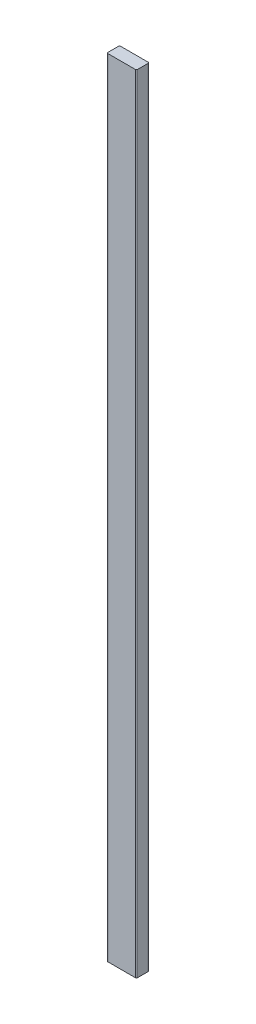
ISO-10303-21;
HEADER;
FILE_DESCRIPTION(('STEP AP214'),'2;1');
FILE_NAME('part.step','',(''),(''),'','','');
FILE_SCHEMA(('AUTOMOTIVE_DESIGN { 1 0 10303 214 1 1 1 1 }'));
ENDSEC;
DATA;
#1=APPLICATION_CONTEXT('core data for automotive mechanical design processes');
#2=APPLICATION_PROTOCOL_DEFINITION('international standard','automotive_design',2000,#1);
#3=PRODUCT_CONTEXT('',#1,'mechanical');
#4=PRODUCT('Part','Part','',(#3));
#5=PRODUCT_RELATED_PRODUCT_CATEGORY('part','',(#4));
#6=PRODUCT_DEFINITION_FORMATION('','',#4);
#7=PRODUCT_DEFINITION_CONTEXT('part definition',#1,'design');
#8=PRODUCT_DEFINITION('design','',#6,#7);
#9=PRODUCT_DEFINITION_SHAPE('','',#8);
#10=(LENGTH_UNIT() NAMED_UNIT(*) SI_UNIT(.MILLI.,.METRE.));
#11=(NAMED_UNIT(*) PLANE_ANGLE_UNIT() SI_UNIT($,.RADIAN.));
#12=(NAMED_UNIT(*) SI_UNIT($,.STERADIAN.) SOLID_ANGLE_UNIT());
#13=UNCERTAINTY_MEASURE_WITH_UNIT(LENGTH_MEASURE(1.E-05),#10,'distance_accuracy_value','');
#14=(GEOMETRIC_REPRESENTATION_CONTEXT(3) GLOBAL_UNCERTAINTY_ASSIGNED_CONTEXT((#13)) GLOBAL_UNIT_ASSIGNED_CONTEXT((#10,
#11,#12)) REPRESENTATION_CONTEXT('',''));
#15=CARTESIAN_POINT('',(0.,0.,0.));
#16=DIRECTION('',(0.,0.,1.));
#17=DIRECTION('',(1.,0.,0.));
#18=AXIS2_PLACEMENT_3D('',#15,#16,#17);
#19=CARTESIAN_POINT('',(-44.45,2362.2,-19.05));
#20=DIRECTION('',(1.,0.,0.));
#21=DIRECTION('',(0.,0.,-1.));
#22=AXIS2_PLACEMENT_3D('',#19,#20,#21);
#23=PLANE('',#22);
#24=DIRECTION('',(0.,0.,1.));
#25=VECTOR('',#24,1.);
#26=CARTESIAN_POINT('',(-44.45,0.,-19.05));
#27=LINE('',#26,#25);
#28=CARTESIAN_POINT('',(-44.45,0.,-15.875));
#29=VERTEX_POINT('',#28);
#30=CARTESIAN_POINT('',(-44.45,0.,15.875));
#31=VERTEX_POINT('',#30);
#32=EDGE_CURVE('E128',#29,#31,#27,.T.);
#33=ORIENTED_EDGE('',*,*,#32,.T.);
#34=DIRECTION('',(0.,-1.,0.));
#35=VECTOR('',#34,1.);
#36=CARTESIAN_POINT('',(-44.45,2362.2,15.875));
#37=LINE('',#36,#35);
#38=CARTESIAN_POINT('',(-44.45,2362.2,15.875));
#39=VERTEX_POINT('',#38);
#40=EDGE_CURVE('E105',#31,#39,#37,.F.);
#41=ORIENTED_EDGE('',*,*,#40,.T.);
#42=DIRECTION('',(0.,0.,1.));
#43=VECTOR('',#42,1.);
#44=CARTESIAN_POINT('',(-44.45,2362.2,-19.05));
#45=LINE('',#44,#43);
#46=CARTESIAN_POINT('',(-44.45,2362.2,-15.875));
#47=VERTEX_POINT('',#46);
#48=EDGE_CURVE('E137',#47,#39,#45,.T.);
#49=ORIENTED_EDGE('',*,*,#48,.F.);
#50=DIRECTION('',(0.,-1.,0.));
#51=VECTOR('',#50,1.);
#52=CARTESIAN_POINT('',(-44.45,2362.2,-15.875));
#53=LINE('',#52,#51);
#54=EDGE_CURVE('E110',#47,#29,#53,.T.);
#55=ORIENTED_EDGE('',*,*,#54,.T.);
#56=EDGE_LOOP('',(#33,#41,#49,#55));
#57=FACE_BOUND('',#56,.T.);
#58=ADVANCED_FACE('F33',(#57),#23,.F.);
#59=CARTESIAN_POINT('',(44.45,2362.2,19.05));
#60=DIRECTION('',(0.,0.,-1.));
#61=DIRECTION('',(-1.,0.,0.));
#62=AXIS2_PLACEMENT_3D('',#59,#60,#61);
#63=PLANE('',#62);
#64=DIRECTION('',(1.,0.,0.));
#65=VECTOR('',#64,1.);
#66=CARTESIAN_POINT('',(44.45,2362.2,19.05));
#67=LINE('',#66,#65);
#68=CARTESIAN_POINT('',(-41.275,2362.2,19.05));
#69=VERTEX_POINT('',#68);
#70=CARTESIAN_POINT('',(41.275,2362.2,19.05));
#71=VERTEX_POINT('',#70);
#72=EDGE_CURVE('E120',#69,#71,#67,.T.);
#73=ORIENTED_EDGE('',*,*,#72,.F.);
#74=DIRECTION('',(0.,-1.,0.));
#75=VECTOR('',#74,1.);
#76=CARTESIAN_POINT('',(-41.275,2362.2,19.05));
#77=LINE('',#76,#75);
#78=CARTESIAN_POINT('',(-41.275,0.,19.05));
#79=VERTEX_POINT('',#78);
#80=EDGE_CURVE('E104',#69,#79,#77,.T.);
#81=ORIENTED_EDGE('',*,*,#80,.T.);
#82=DIRECTION('',(1.,0.,0.));
#83=VECTOR('',#82,1.);
#84=CARTESIAN_POINT('',(44.45,0.,19.05));
#85=LINE('',#84,#83);
#86=CARTESIAN_POINT('',(41.275,0.,19.05));
#87=VERTEX_POINT('',#86);
#88=EDGE_CURVE('E117',#79,#87,#85,.T.);
#89=ORIENTED_EDGE('',*,*,#88,.T.);
#90=DIRECTION('',(0.,-1.,0.));
#91=VECTOR('',#90,1.);
#92=CARTESIAN_POINT('',(41.275,2362.2,19.05));
#93=LINE('',#92,#91);
#94=EDGE_CURVE('E122',#87,#71,#93,.F.);
#95=ORIENTED_EDGE('',*,*,#94,.T.);
#96=EDGE_LOOP('',(#73,#81,#89,#95));
#97=FACE_BOUND('',#96,.T.);
#98=ADVANCED_FACE('F116',(#97),#63,.F.);
#99=CARTESIAN_POINT('',(44.45,2362.2,-19.05));
#100=DIRECTION('',(-1.,0.,0.));
#101=DIRECTION('',(0.,0.,1.));
#102=AXIS2_PLACEMENT_3D('',#99,#100,#101);
#103=PLANE('',#102);
#104=DIRECTION('',(0.,0.,-1.));
#105=VECTOR('',#104,1.);
#106=CARTESIAN_POINT('',(44.45,2362.2,-19.05));
#107=LINE('',#106,#105);
#108=CARTESIAN_POINT('',(44.45,2362.2,15.875));
#109=VERTEX_POINT('',#108);
#110=CARTESIAN_POINT('',(44.45,2362.2,-15.875));
#111=VERTEX_POINT('',#110);
#112=EDGE_CURVE('E160',#109,#111,#107,.T.);
#113=ORIENTED_EDGE('',*,*,#112,.F.);
#114=DIRECTION('',(0.,-1.,0.));
#115=VECTOR('',#114,1.);
#116=CARTESIAN_POINT('',(44.45,2362.2,15.875));
#117=LINE('',#116,#115);
#118=CARTESIAN_POINT('',(44.45,0.,15.875));
#119=VERTEX_POINT('',#118);
#120=EDGE_CURVE('E11',#109,#119,#117,.T.);
#121=ORIENTED_EDGE('',*,*,#120,.T.);
#122=DIRECTION('',(0.,0.,-1.));
#123=VECTOR('',#122,1.);
#124=CARTESIAN_POINT('',(44.45,0.,-19.05));
#125=LINE('',#124,#123);
#126=CARTESIAN_POINT('',(44.45,0.,-15.875));
#127=VERTEX_POINT('',#126);
#128=EDGE_CURVE('E127',#119,#127,#125,.T.);
#129=ORIENTED_EDGE('',*,*,#128,.T.);
#130=DIRECTION('',(0.,-1.,0.));
#131=VECTOR('',#130,1.);
#132=CARTESIAN_POINT('',(44.45,2362.2,-15.875));
#133=LINE('',#132,#131);
#134=EDGE_CURVE('E41',#127,#111,#133,.F.);
#135=ORIENTED_EDGE('',*,*,#134,.T.);
#136=EDGE_LOOP('',(#113,#121,#129,#135));
#137=FACE_BOUND('',#136,.T.);
#138=ADVANCED_FACE('F159',(#137),#103,.F.);
#139=CARTESIAN_POINT('',(44.45,2362.2,-19.05));
#140=DIRECTION('',(0.,0.,1.));
#141=DIRECTION('',(1.,0.,0.));
#142=AXIS2_PLACEMENT_3D('',#139,#140,#141);
#143=PLANE('',#142);
#144=DIRECTION('',(-1.,0.,0.));
#145=VECTOR('',#144,1.);
#146=CARTESIAN_POINT('',(44.45,0.,-19.05));
#147=LINE('',#146,#145);
#148=CARTESIAN_POINT('',(41.275,0.,-19.05));
#149=VERTEX_POINT('',#148);
#150=CARTESIAN_POINT('',(-41.275,0.,-19.05));
#151=VERTEX_POINT('',#150);
#152=EDGE_CURVE('E131',#149,#151,#147,.T.);
#153=ORIENTED_EDGE('',*,*,#152,.T.);
#154=DIRECTION('',(0.,-1.,0.));
#155=VECTOR('',#154,1.);
#156=CARTESIAN_POINT('',(-41.275,2362.2,-19.05));
#157=LINE('',#156,#155);
#158=CARTESIAN_POINT('',(-41.275,2362.2,-19.05));
#159=VERTEX_POINT('',#158);
#160=EDGE_CURVE('E48',#151,#159,#157,.F.);
#161=ORIENTED_EDGE('',*,*,#160,.T.);
#162=DIRECTION('',(-1.,0.,0.));
#163=VECTOR('',#162,1.);
#164=CARTESIAN_POINT('',(44.45,2362.2,-19.05));
#165=LINE('',#164,#163);
#166=CARTESIAN_POINT('',(41.275,2362.2,-19.05));
#167=VERTEX_POINT('',#166);
#168=EDGE_CURVE('E138',#167,#159,#165,.T.);
#169=ORIENTED_EDGE('',*,*,#168,.F.);
#170=DIRECTION('',(0.,-1.,0.));
#171=VECTOR('',#170,1.);
#172=CARTESIAN_POINT('',(41.275,2362.2,-19.05));
#173=LINE('',#172,#171);
#174=EDGE_CURVE('E153',#167,#149,#173,.T.);
#175=ORIENTED_EDGE('',*,*,#174,.T.);
#176=EDGE_LOOP('',(#153,#161,#169,#175));
#177=FACE_BOUND('',#176,.T.);
#178=ADVANCED_FACE('F169',(#177),#143,.F.);
#179=CARTESIAN_POINT('',(0.,2362.2,0.));
#180=DIRECTION('',(0.,-1.,0.));
#181=DIRECTION('',(0.,0.,-1.));
#182=AXIS2_PLACEMENT_3D('',#179,#180,#181);
#183=PLANE('',#182);
#184=ORIENTED_EDGE('',*,*,#48,.T.);
#185=CARTESIAN_POINT('',(-41.275,2362.2,15.875));
#186=DIRECTION('',(0.,-1.,0.));
#187=DIRECTION('',(0.,0.,-1.));
#188=AXIS2_PLACEMENT_3D('',#185,#186,#187);
#189=CIRCLE('',#188,3.175);
#190=EDGE_CURVE('E151',#39,#69,#189,.F.);
#191=ORIENTED_EDGE('',*,*,#190,.T.);
#192=ORIENTED_EDGE('',*,*,#72,.T.);
#193=CARTESIAN_POINT('',(41.275,2362.2,15.875));
#194=DIRECTION('',(0.,-1.,0.));
#195=DIRECTION('',(0.,0.,-1.));
#196=AXIS2_PLACEMENT_3D('',#193,#194,#195);
#197=CIRCLE('',#196,3.175);
#198=EDGE_CURVE('E147',#71,#109,#197,.F.);
#199=ORIENTED_EDGE('',*,*,#198,.T.);
#200=ORIENTED_EDGE('',*,*,#112,.T.);
#201=CARTESIAN_POINT('',(41.275,2362.2,-15.875));
#202=DIRECTION('',(0.,-1.,0.));
#203=DIRECTION('',(0.,0.,-1.));
#204=AXIS2_PLACEMENT_3D('',#201,#202,#203);
#205=CIRCLE('',#204,3.175);
#206=EDGE_CURVE('E55',#111,#167,#205,.F.);
#207=ORIENTED_EDGE('',*,*,#206,.T.);
#208=ORIENTED_EDGE('',*,*,#168,.T.);
#209=CARTESIAN_POINT('',(-41.275,2362.2,-15.875));
#210=DIRECTION('',(0.,-1.,0.));
#211=DIRECTION('',(0.,0.,-1.));
#212=AXIS2_PLACEMENT_3D('',#209,#210,#211);
#213=CIRCLE('',#212,3.175);
#214=EDGE_CURVE('E149',#159,#47,#213,.F.);
#215=ORIENTED_EDGE('',*,*,#214,.T.);
#216=EDGE_LOOP('',(#184,#191,#192,#199,#200,#207,#208,#215));
#217=FACE_BOUND('',#216,.T.);
#218=ADVANCED_FACE('F164',(#217),#183,.F.);
#219=CARTESIAN_POINT('',(0.,0.,0.));
#220=DIRECTION('',(0.,-1.,0.));
#221=DIRECTION('',(0.,0.,-1.));
#222=AXIS2_PLACEMENT_3D('',#219,#220,#221);
#223=PLANE('',#222);
#224=ORIENTED_EDGE('',*,*,#88,.F.);
#225=CARTESIAN_POINT('',(-41.275,0.,15.875));
#226=DIRECTION('',(0.,-1.,0.));
#227=DIRECTION('',(0.,0.,-1.));
#228=AXIS2_PLACEMENT_3D('',#225,#226,#227);
#229=CIRCLE('',#228,3.175);
#230=EDGE_CURVE('E100',#79,#31,#229,.T.);
#231=ORIENTED_EDGE('',*,*,#230,.T.);
#232=ORIENTED_EDGE('',*,*,#32,.F.);
#233=CARTESIAN_POINT('',(-41.275,0.,-15.875));
#234=DIRECTION('',(0.,-1.,0.));
#235=DIRECTION('',(0.,0.,-1.));
#236=AXIS2_PLACEMENT_3D('',#233,#234,#235);
#237=CIRCLE('',#236,3.175);
#238=EDGE_CURVE('E111',#29,#151,#237,.T.);
#239=ORIENTED_EDGE('',*,*,#238,.T.);
#240=ORIENTED_EDGE('',*,*,#152,.F.);
#241=CARTESIAN_POINT('',(41.275,0.,-15.875));
#242=DIRECTION('',(0.,-1.,0.));
#243=DIRECTION('',(0.,0.,-1.));
#244=AXIS2_PLACEMENT_3D('',#241,#242,#243);
#245=CIRCLE('',#244,3.175);
#246=EDGE_CURVE('E121',#149,#127,#245,.T.);
#247=ORIENTED_EDGE('',*,*,#246,.T.);
#248=ORIENTED_EDGE('',*,*,#128,.F.);
#249=CARTESIAN_POINT('',(41.275,0.,15.875));
#250=DIRECTION('',(0.,-1.,0.));
#251=DIRECTION('',(0.,0.,-1.));
#252=AXIS2_PLACEMENT_3D('',#249,#250,#251);
#253=CIRCLE('',#252,3.175);
#254=EDGE_CURVE('E126',#119,#87,#253,.T.);
#255=ORIENTED_EDGE('',*,*,#254,.T.);
#256=EDGE_LOOP('',(#224,#231,#232,#239,#240,#247,#248,#255));
#257=FACE_BOUND('',#256,.T.);
#258=ADVANCED_FACE('F124',(#257),#223,.T.);
#259=CARTESIAN_POINT('',(-41.275,2362.2,15.875));
#260=DIRECTION('',(0.,-1.,0.));
#261=DIRECTION('',(0.,0.,-1.));
#262=AXIS2_PLACEMENT_3D('',#259,#260,#261);
#263=CYLINDRICAL_SURFACE('',#262,3.175);
#264=ORIENTED_EDGE('',*,*,#190,.F.);
#265=ORIENTED_EDGE('',*,*,#40,.F.);
#266=ORIENTED_EDGE('',*,*,#230,.F.);
#267=ORIENTED_EDGE('',*,*,#80,.F.);
#268=EDGE_LOOP('',(#264,#265,#266,#267));
#269=FACE_BOUND('',#268,.T.);
#270=ADVANCED_FACE('F103',(#269),#263,.T.);
#271=CARTESIAN_POINT('',(-41.275,2362.2,-15.875));
#272=DIRECTION('',(0.,-1.,0.));
#273=DIRECTION('',(0.,0.,-1.));
#274=AXIS2_PLACEMENT_3D('',#271,#272,#273);
#275=CYLINDRICAL_SURFACE('',#274,3.175);
#276=ORIENTED_EDGE('',*,*,#214,.F.);
#277=ORIENTED_EDGE('',*,*,#160,.F.);
#278=ORIENTED_EDGE('',*,*,#238,.F.);
#279=ORIENTED_EDGE('',*,*,#54,.F.);
#280=EDGE_LOOP('',(#276,#277,#278,#279));
#281=FACE_BOUND('',#280,.T.);
#282=ADVANCED_FACE('F173',(#281),#275,.T.);
#283=CARTESIAN_POINT('',(41.275,2362.2,15.875));
#284=DIRECTION('',(0.,-1.,0.));
#285=DIRECTION('',(0.,0.,-1.));
#286=AXIS2_PLACEMENT_3D('',#283,#284,#285);
#287=CYLINDRICAL_SURFACE('',#286,3.175);
#288=ORIENTED_EDGE('',*,*,#198,.F.);
#289=ORIENTED_EDGE('',*,*,#94,.F.);
#290=ORIENTED_EDGE('',*,*,#254,.F.);
#291=ORIENTED_EDGE('',*,*,#120,.F.);
#292=EDGE_LOOP('',(#288,#289,#290,#291));
#293=FACE_BOUND('',#292,.T.);
#294=ADVANCED_FACE('F179',(#293),#287,.T.);
#295=CARTESIAN_POINT('',(41.275,2362.2,-15.875));
#296=DIRECTION('',(0.,-1.,0.));
#297=DIRECTION('',(0.,0.,-1.));
#298=AXIS2_PLACEMENT_3D('',#295,#296,#297);
#299=CYLINDRICAL_SURFACE('',#298,3.175);
#300=ORIENTED_EDGE('',*,*,#206,.F.);
#301=ORIENTED_EDGE('',*,*,#134,.F.);
#302=ORIENTED_EDGE('',*,*,#246,.F.);
#303=ORIENTED_EDGE('',*,*,#174,.F.);
#304=EDGE_LOOP('',(#300,#301,#302,#303));
#305=FACE_BOUND('',#304,.T.);
#306=ADVANCED_FACE('F35',(#305),#299,.T.);
#307=CLOSED_SHELL('',(#58,#98,#138,#178,#218,#258,#270,#282,#294,#306));
#308=MANIFOLD_SOLID_BREP('B2',#307);
#309=ADVANCED_BREP_SHAPE_REPRESENTATION('',(#18,#308),#14);
#310=SHAPE_DEFINITION_REPRESENTATION(#9,#309);
ENDSEC;
END-ISO-10303-21;
